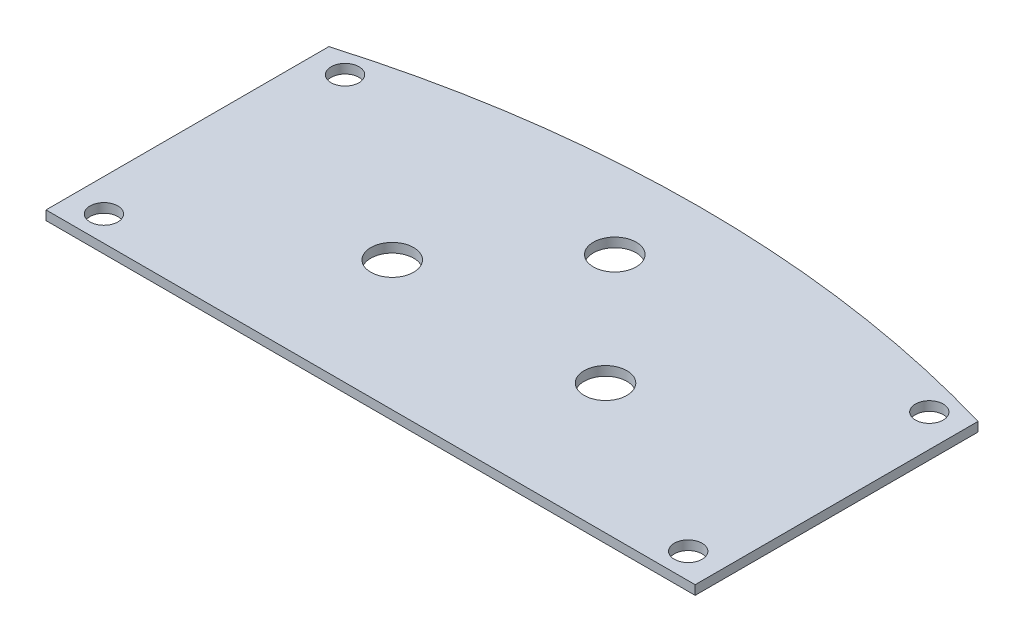
ISO-10303-21;
HEADER;
FILE_DESCRIPTION(('STEP AP214'),'2;1');
FILE_NAME('part.step','',(''),(''),'','','');
FILE_SCHEMA(('AUTOMOTIVE_DESIGN { 1 0 10303 214 1 1 1 1 }'));
ENDSEC;
DATA;
#1=APPLICATION_CONTEXT('core data for automotive mechanical design processes');
#2=APPLICATION_PROTOCOL_DEFINITION('international standard','automotive_design',2000,#1);
#3=PRODUCT_CONTEXT('',#1,'mechanical');
#4=PRODUCT('Part','Part','',(#3));
#5=PRODUCT_RELATED_PRODUCT_CATEGORY('part','',(#4));
#6=PRODUCT_DEFINITION_FORMATION('','',#4);
#7=PRODUCT_DEFINITION_CONTEXT('part definition',#1,'design');
#8=PRODUCT_DEFINITION('design','',#6,#7);
#9=PRODUCT_DEFINITION_SHAPE('','',#8);
#10=(LENGTH_UNIT() NAMED_UNIT(*) SI_UNIT(.MILLI.,.METRE.));
#11=(NAMED_UNIT(*) PLANE_ANGLE_UNIT() SI_UNIT($,.RADIAN.));
#12=(NAMED_UNIT(*) SI_UNIT($,.STERADIAN.) SOLID_ANGLE_UNIT());
#13=UNCERTAINTY_MEASURE_WITH_UNIT(LENGTH_MEASURE(1.E-05),#10,'distance_accuracy_value','');
#14=(GEOMETRIC_REPRESENTATION_CONTEXT(3) GLOBAL_UNCERTAINTY_ASSIGNED_CONTEXT((#13)) GLOBAL_UNIT_ASSIGNED_CONTEXT((#10,
#11,#12)) REPRESENTATION_CONTEXT('',''));
#15=CARTESIAN_POINT('',(0.,0.,0.));
#16=DIRECTION('',(0.,0.,1.));
#17=DIRECTION('',(1.,0.,0.));
#18=AXIS2_PLACEMENT_3D('',#15,#16,#17);
#19=CARTESIAN_POINT('',(0.,3.,210.156596281632));
#20=DIRECTION('',(0.,-1.,0.));
#21=DIRECTION('',(0.,0.,-1.));
#22=AXIS2_PLACEMENT_3D('',#19,#20,#21);
#23=CYLINDRICAL_SURFACE('',#22,248.710616879806);
#24=DIRECTION('',(0.,-1.,0.));
#25=VECTOR('',#24,1.);
#26=CARTESIAN_POINT('',(70.,3.,-28.5));
#27=LINE('',#26,#25);
#28=CARTESIAN_POINT('',(70.,3.,-28.5));
#29=VERTEX_POINT('',#28);
#30=CARTESIAN_POINT('',(70.,1.,-28.5));
#31=VERTEX_POINT('',#30);
#32=EDGE_CURVE('E98',#29,#31,#27,.T.);
#33=ORIENTED_EDGE('',*,*,#32,.T.);
#34=CARTESIAN_POINT('',(0.,1.,210.156596281632));
#35=DIRECTION('',(0.,1.,0.));
#36=DIRECTION('',(0.,0.,1.));
#37=AXIS2_PLACEMENT_3D('',#34,#35,#36);
#38=CIRCLE('',#37,248.710616879806);
#39=CARTESIAN_POINT('',(-70.,1.,-28.5));
#40=VERTEX_POINT('',#39);
#41=EDGE_CURVE('E55',#31,#40,#38,.T.);
#42=ORIENTED_EDGE('',*,*,#41,.T.);
#43=DIRECTION('',(0.,-1.,0.));
#44=VECTOR('',#43,1.);
#45=CARTESIAN_POINT('',(-70.,3.,-28.5));
#46=LINE('',#45,#44);
#47=CARTESIAN_POINT('',(-70.,3.,-28.5));
#48=VERTEX_POINT('',#47);
#49=EDGE_CURVE('E11',#48,#40,#46,.T.);
#50=ORIENTED_EDGE('',*,*,#49,.F.);
#51=CARTESIAN_POINT('',(0.,3.,210.156596281632));
#52=DIRECTION('',(0.,1.,0.));
#53=DIRECTION('',(0.,0.,-1.));
#54=AXIS2_PLACEMENT_3D('',#51,#52,#53);
#55=CIRCLE('',#54,248.710616879806);
#56=EDGE_CURVE('E108',#29,#48,#55,.T.);
#57=ORIENTED_EDGE('',*,*,#56,.F.);
#58=EDGE_LOOP('',(#33,#42,#50,#57));
#59=FACE_BOUND('',#58,.T.);
#60=ADVANCED_FACE('F40',(#59),#23,.T.);
#61=CARTESIAN_POINT('',(-70.,3.,32.5));
#62=DIRECTION('',(1.,0.,0.));
#63=DIRECTION('',(0.,0.,-1.));
#64=AXIS2_PLACEMENT_3D('',#61,#62,#63);
#65=PLANE('',#64);
#66=ORIENTED_EDGE('',*,*,#49,.T.);
#67=DIRECTION('',(0.,0.,1.));
#68=VECTOR('',#67,1.);
#69=CARTESIAN_POINT('',(-70.,1.,-47.5));
#70=LINE('',#69,#68);
#71=CARTESIAN_POINT('',(-70.,1.,32.5));
#72=VERTEX_POINT('',#71);
#73=EDGE_CURVE('E87',#40,#72,#70,.T.);
#74=ORIENTED_EDGE('',*,*,#73,.T.);
#75=DIRECTION('',(0.,-1.,0.));
#76=VECTOR('',#75,1.);
#77=CARTESIAN_POINT('',(-70.,3.,32.5));
#78=LINE('',#77,#76);
#79=CARTESIAN_POINT('',(-70.,3.,32.5));
#80=VERTEX_POINT('',#79);
#81=EDGE_CURVE('E48',#80,#72,#78,.T.);
#82=ORIENTED_EDGE('',*,*,#81,.F.);
#83=DIRECTION('',(0.,0.,1.));
#84=VECTOR('',#83,1.);
#85=CARTESIAN_POINT('',(-70.,3.,32.5));
#86=LINE('',#85,#84);
#87=EDGE_CURVE('E106',#48,#80,#86,.T.);
#88=ORIENTED_EDGE('',*,*,#87,.F.);
#89=EDGE_LOOP('',(#66,#74,#82,#88));
#90=FACE_BOUND('',#89,.T.);
#91=ADVANCED_FACE('F181',(#90),#65,.F.);
#92=CARTESIAN_POINT('',(-70.,3.,32.5));
#93=DIRECTION('',(0.,0.,-1.));
#94=DIRECTION('',(-1.,0.,0.));
#95=AXIS2_PLACEMENT_3D('',#92,#93,#94);
#96=PLANE('',#95);
#97=ORIENTED_EDGE('',*,*,#81,.T.);
#98=DIRECTION('',(-1.,0.,0.));
#99=VECTOR('',#98,1.);
#100=CARTESIAN_POINT('',(-70.,1.,32.5));
#101=LINE('',#100,#99);
#102=CARTESIAN_POINT('',(70.,1.,32.5));
#103=VERTEX_POINT('',#102);
#104=EDGE_CURVE('E82',#103,#72,#101,.T.);
#105=ORIENTED_EDGE('',*,*,#104,.F.);
#106=DIRECTION('',(0.,-1.,0.));
#107=VECTOR('',#106,1.);
#108=CARTESIAN_POINT('',(70.,3.,32.5));
#109=LINE('',#108,#107);
#110=CARTESIAN_POINT('',(70.,3.,32.5));
#111=VERTEX_POINT('',#110);
#112=EDGE_CURVE('E94',#111,#103,#109,.T.);
#113=ORIENTED_EDGE('',*,*,#112,.F.);
#114=DIRECTION('',(1.,0.,0.));
#115=VECTOR('',#114,1.);
#116=CARTESIAN_POINT('',(-70.,3.,32.5));
#117=LINE('',#116,#115);
#118=EDGE_CURVE('E104',#80,#111,#117,.T.);
#119=ORIENTED_EDGE('',*,*,#118,.F.);
#120=EDGE_LOOP('',(#97,#105,#113,#119));
#121=FACE_BOUND('',#120,.T.);
#122=ADVANCED_FACE('F92',(#121),#96,.F.);
#123=CARTESIAN_POINT('',(70.,3.,-28.5));
#124=DIRECTION('',(-1.,0.,0.));
#125=DIRECTION('',(0.,0.,1.));
#126=AXIS2_PLACEMENT_3D('',#123,#124,#125);
#127=PLANE('',#126);
#128=ORIENTED_EDGE('',*,*,#112,.T.);
#129=DIRECTION('',(0.,0.,1.));
#130=VECTOR('',#129,1.);
#131=CARTESIAN_POINT('',(70.,1.,-47.5));
#132=LINE('',#131,#130);
#133=EDGE_CURVE('E79',#31,#103,#132,.T.);
#134=ORIENTED_EDGE('',*,*,#133,.F.);
#135=ORIENTED_EDGE('',*,*,#32,.F.);
#136=DIRECTION('',(0.,0.,-1.));
#137=VECTOR('',#136,1.);
#138=CARTESIAN_POINT('',(70.,3.,-28.5));
#139=LINE('',#138,#137);
#140=EDGE_CURVE('E63',#111,#29,#139,.T.);
#141=ORIENTED_EDGE('',*,*,#140,.F.);
#142=EDGE_LOOP('',(#128,#134,#135,#141));
#143=FACE_BOUND('',#142,.T.);
#144=ADVANCED_FACE('F97',(#143),#127,.F.);
#145=CARTESIAN_POINT('',(0.,3.,210.156596281632));
#146=DIRECTION('',(0.,-1.,0.));
#147=DIRECTION('',(0.,0.,-1.));
#148=AXIS2_PLACEMENT_3D('',#145,#146,#147);
#149=PLANE('',#148);
#150=CARTESIAN_POINT('',(-23.33,3.,4.50000000000001));
#151=DIRECTION('',(0.,1.,0.));
#152=DIRECTION('',(0.,0.,1.));
#153=AXIS2_PLACEMENT_3D('',#150,#151,#152);
#154=CIRCLE('',#153,4.62);
#155=CARTESIAN_POINT('',(-23.33,3.,9.12000000000001));
#156=VERTEX_POINT('',#155);
#157=EDGE_CURVE('E122',#156,#156,#154,.T.);
#158=ORIENTED_EDGE('',*,*,#157,.F.);
#159=EDGE_LOOP('',(#158));
#160=FACE_BOUND('',#159,.T.);
#161=CARTESIAN_POINT('',(22.67,3.,4.50000000000001));
#162=DIRECTION('',(0.,1.,0.));
#163=DIRECTION('',(0.,0.,1.));
#164=AXIS2_PLACEMENT_3D('',#161,#162,#163);
#165=CIRCLE('',#164,4.62);
#166=CARTESIAN_POINT('',(22.67,3.,9.12000000000001));
#167=VERTEX_POINT('',#166);
#168=EDGE_CURVE('E126',#167,#167,#165,.T.);
#169=ORIENTED_EDGE('',*,*,#168,.F.);
#170=EDGE_LOOP('',(#169));
#171=FACE_BOUND('',#170,.T.);
#172=CARTESIAN_POINT('',(-0.330000000000004,3.,-20.4992179877691));
#173=DIRECTION('',(0.,1.,0.));
#174=DIRECTION('',(0.,0.,1.));
#175=AXIS2_PLACEMENT_3D('',#172,#173,#174);
#176=CIRCLE('',#175,4.62);
#177=CARTESIAN_POINT('',(-0.330000000000004,3.,-15.8792179877691));
#178=VERTEX_POINT('',#177);
#179=EDGE_CURVE('E123',#178,#178,#176,.T.);
#180=ORIENTED_EDGE('',*,*,#179,.F.);
#181=EDGE_LOOP('',(#180));
#182=FACE_BOUND('',#181,.T.);
#183=CARTESIAN_POINT('',(-63.,3.,27.));
#184=DIRECTION('',(0.,1.,0.));
#185=DIRECTION('',(0.,0.,1.));
#186=AXIS2_PLACEMENT_3D('',#183,#184,#185);
#187=CIRCLE('',#186,3.);
#188=CARTESIAN_POINT('',(-63.,3.,30.));
#189=VERTEX_POINT('',#188);
#190=EDGE_CURVE('E113',#189,#189,#187,.T.);
#191=ORIENTED_EDGE('',*,*,#190,.F.);
#192=EDGE_LOOP('',(#191));
#193=FACE_BOUND('',#192,.T.);
#194=CARTESIAN_POINT('',(63.,3.,-25.));
#195=DIRECTION('',(0.,1.,0.));
#196=DIRECTION('',(0.,0.,1.));
#197=AXIS2_PLACEMENT_3D('',#194,#195,#196);
#198=CIRCLE('',#197,3.00000000000001);
#199=CARTESIAN_POINT('',(63.,3.,-22.));
#200=VERTEX_POINT('',#199);
#201=EDGE_CURVE('E114',#200,#200,#198,.T.);
#202=ORIENTED_EDGE('',*,*,#201,.F.);
#203=EDGE_LOOP('',(#202));
#204=FACE_BOUND('',#203,.T.);
#205=CARTESIAN_POINT('',(63.,3.,27.));
#206=DIRECTION('',(0.,1.,0.));
#207=DIRECTION('',(0.,0.,1.));
#208=AXIS2_PLACEMENT_3D('',#205,#206,#207);
#209=CIRCLE('',#208,3.00000000000001);
#210=CARTESIAN_POINT('',(63.,3.,30.));
#211=VERTEX_POINT('',#210);
#212=EDGE_CURVE('E117',#211,#211,#209,.T.);
#213=ORIENTED_EDGE('',*,*,#212,.F.);
#214=EDGE_LOOP('',(#213));
#215=FACE_BOUND('',#214,.T.);
#216=CARTESIAN_POINT('',(-63.,3.,-25.));
#217=DIRECTION('',(0.,1.,0.));
#218=DIRECTION('',(0.,0.,1.));
#219=AXIS2_PLACEMENT_3D('',#216,#217,#218);
#220=CIRCLE('',#219,3.);
#221=CARTESIAN_POINT('',(-63.,3.,-22.));
#222=VERTEX_POINT('',#221);
#223=EDGE_CURVE('E110',#222,#222,#220,.T.);
#224=ORIENTED_EDGE('',*,*,#223,.F.);
#225=EDGE_LOOP('',(#224));
#226=FACE_BOUND('',#225,.T.);
#227=ORIENTED_EDGE('',*,*,#56,.T.);
#228=ORIENTED_EDGE('',*,*,#87,.T.);
#229=ORIENTED_EDGE('',*,*,#118,.T.);
#230=ORIENTED_EDGE('',*,*,#140,.T.);
#231=EDGE_LOOP('',(#227,#228,#229,#230));
#232=FACE_BOUND('',#231,.T.);
#233=ADVANCED_FACE('F171',(#160,#171,#182,#193,#204,#215,#226,#232),#149,.F.);
#234=CARTESIAN_POINT('',(-63.,-7.,-25.));
#235=DIRECTION('',(0.,1.,0.));
#236=DIRECTION('',(0.,0.,1.));
#237=AXIS2_PLACEMENT_3D('',#234,#235,#236);
#238=CYLINDRICAL_SURFACE('',#237,3.);
#239=CARTESIAN_POINT('',(-63.,1.,-25.));
#240=DIRECTION('',(0.,1.,0.));
#241=DIRECTION('',(0.,0.,1.));
#242=AXIS2_PLACEMENT_3D('',#239,#240,#241);
#243=CIRCLE('',#242,3.);
#244=CARTESIAN_POINT('',(-63.,1.,-22.));
#245=VERTEX_POINT('',#244);
#246=EDGE_CURVE('E132',#245,#245,#243,.F.);
#247=ORIENTED_EDGE('',*,*,#246,.T.);
#248=EDGE_LOOP('',(#247));
#249=FACE_BOUND('',#248,.T.);
#250=ORIENTED_EDGE('',*,*,#223,.T.);
#251=EDGE_LOOP('',(#250));
#252=FACE_BOUND('',#251,.T.);
#253=ADVANCED_FACE('F167',(#249,#252),#238,.F.);
#254=CARTESIAN_POINT('',(63.,-7.,27.));
#255=DIRECTION('',(0.,1.,0.));
#256=DIRECTION('',(0.,0.,1.));
#257=AXIS2_PLACEMENT_3D('',#254,#255,#256);
#258=CYLINDRICAL_SURFACE('',#257,3.00000000000001);
#259=CARTESIAN_POINT('',(63.,1.,27.));
#260=DIRECTION('',(0.,1.,0.));
#261=DIRECTION('',(0.,0.,1.));
#262=AXIS2_PLACEMENT_3D('',#259,#260,#261);
#263=CIRCLE('',#262,3.00000000000001);
#264=CARTESIAN_POINT('',(63.,1.,30.));
#265=VERTEX_POINT('',#264);
#266=EDGE_CURVE('E135',#265,#265,#263,.F.);
#267=ORIENTED_EDGE('',*,*,#266,.T.);
#268=EDGE_LOOP('',(#267));
#269=FACE_BOUND('',#268,.T.);
#270=ORIENTED_EDGE('',*,*,#212,.T.);
#271=EDGE_LOOP('',(#270));
#272=FACE_BOUND('',#271,.T.);
#273=ADVANCED_FACE('F170',(#269,#272),#258,.F.);
#274=CARTESIAN_POINT('',(63.,-7.,-25.));
#275=DIRECTION('',(0.,1.,0.));
#276=DIRECTION('',(0.,0.,1.));
#277=AXIS2_PLACEMENT_3D('',#274,#275,#276);
#278=CYLINDRICAL_SURFACE('',#277,3.00000000000001);
#279=CARTESIAN_POINT('',(63.,1.,-25.));
#280=DIRECTION('',(0.,1.,0.));
#281=DIRECTION('',(0.,0.,1.));
#282=AXIS2_PLACEMENT_3D('',#279,#280,#281);
#283=CIRCLE('',#282,3.00000000000001);
#284=CARTESIAN_POINT('',(63.,1.,-22.));
#285=VERTEX_POINT('',#284);
#286=EDGE_CURVE('E138',#285,#285,#283,.F.);
#287=ORIENTED_EDGE('',*,*,#286,.T.);
#288=EDGE_LOOP('',(#287));
#289=FACE_BOUND('',#288,.T.);
#290=ORIENTED_EDGE('',*,*,#201,.T.);
#291=EDGE_LOOP('',(#290));
#292=FACE_BOUND('',#291,.T.);
#293=ADVANCED_FACE('F191',(#289,#292),#278,.F.);
#294=CARTESIAN_POINT('',(-63.,-7.,27.));
#295=DIRECTION('',(0.,1.,0.));
#296=DIRECTION('',(0.,0.,1.));
#297=AXIS2_PLACEMENT_3D('',#294,#295,#296);
#298=CYLINDRICAL_SURFACE('',#297,3.);
#299=CARTESIAN_POINT('',(-63.,1.,27.));
#300=DIRECTION('',(0.,1.,0.));
#301=DIRECTION('',(0.,0.,1.));
#302=AXIS2_PLACEMENT_3D('',#299,#300,#301);
#303=CIRCLE('',#302,3.);
#304=CARTESIAN_POINT('',(-63.,1.,30.));
#305=VERTEX_POINT('',#304);
#306=EDGE_CURVE('E141',#305,#305,#303,.F.);
#307=ORIENTED_EDGE('',*,*,#306,.T.);
#308=EDGE_LOOP('',(#307));
#309=FACE_BOUND('',#308,.T.);
#310=ORIENTED_EDGE('',*,*,#190,.T.);
#311=EDGE_LOOP('',(#310));
#312=FACE_BOUND('',#311,.T.);
#313=ADVANCED_FACE('F194',(#309,#312),#298,.F.);
#314=CARTESIAN_POINT('',(-0.330000000000004,-7.,-20.4992179877691));
#315=DIRECTION('',(0.,1.,0.));
#316=DIRECTION('',(0.,0.,1.));
#317=AXIS2_PLACEMENT_3D('',#314,#315,#316);
#318=CYLINDRICAL_SURFACE('',#317,4.62);
#319=CARTESIAN_POINT('',(-0.330000000000004,1.,-20.4992179877691));
#320=DIRECTION('',(0.,1.,0.));
#321=DIRECTION('',(0.,0.,1.));
#322=AXIS2_PLACEMENT_3D('',#319,#320,#321);
#323=CIRCLE('',#322,4.62);
#324=CARTESIAN_POINT('',(-0.330000000000004,1.,-15.8792179877691));
#325=VERTEX_POINT('',#324);
#326=EDGE_CURVE('E144',#325,#325,#323,.F.);
#327=ORIENTED_EDGE('',*,*,#326,.T.);
#328=EDGE_LOOP('',(#327));
#329=FACE_BOUND('',#328,.T.);
#330=ORIENTED_EDGE('',*,*,#179,.T.);
#331=EDGE_LOOP('',(#330));
#332=FACE_BOUND('',#331,.T.);
#333=ADVANCED_FACE('F198',(#329,#332),#318,.F.);
#334=CARTESIAN_POINT('',(22.67,-7.,4.50000000000001));
#335=DIRECTION('',(0.,1.,0.));
#336=DIRECTION('',(0.,0.,1.));
#337=AXIS2_PLACEMENT_3D('',#334,#335,#336);
#338=CYLINDRICAL_SURFACE('',#337,4.62);
#339=CARTESIAN_POINT('',(22.67,1.,4.50000000000001));
#340=DIRECTION('',(0.,1.,0.));
#341=DIRECTION('',(0.,0.,1.));
#342=AXIS2_PLACEMENT_3D('',#339,#340,#341);
#343=CIRCLE('',#342,4.62);
#344=CARTESIAN_POINT('',(22.67,1.,9.12000000000001));
#345=VERTEX_POINT('',#344);
#346=EDGE_CURVE('E147',#345,#345,#343,.F.);
#347=ORIENTED_EDGE('',*,*,#346,.T.);
#348=EDGE_LOOP('',(#347));
#349=FACE_BOUND('',#348,.T.);
#350=ORIENTED_EDGE('',*,*,#168,.T.);
#351=EDGE_LOOP('',(#350));
#352=FACE_BOUND('',#351,.T.);
#353=ADVANCED_FACE('F205',(#349,#352),#338,.F.);
#354=CARTESIAN_POINT('',(-23.33,-7.,4.50000000000001));
#355=DIRECTION('',(0.,1.,0.));
#356=DIRECTION('',(0.,0.,1.));
#357=AXIS2_PLACEMENT_3D('',#354,#355,#356);
#358=CYLINDRICAL_SURFACE('',#357,4.62);
#359=CARTESIAN_POINT('',(-23.33,1.,4.50000000000001));
#360=DIRECTION('',(0.,1.,0.));
#361=DIRECTION('',(0.,0.,1.));
#362=AXIS2_PLACEMENT_3D('',#359,#360,#361);
#363=CIRCLE('',#362,4.62);
#364=CARTESIAN_POINT('',(-23.33,1.,9.12000000000001));
#365=VERTEX_POINT('',#364);
#366=EDGE_CURVE('E43',#365,#365,#363,.F.);
#367=ORIENTED_EDGE('',*,*,#366,.T.);
#368=EDGE_LOOP('',(#367));
#369=FACE_BOUND('',#368,.T.);
#370=ORIENTED_EDGE('',*,*,#157,.T.);
#371=EDGE_LOOP('',(#370));
#372=FACE_BOUND('',#371,.T.);
#373=ADVANCED_FACE('F154',(#369,#372),#358,.F.);
#374=CARTESIAN_POINT('',(-70.,1.,-47.5));
#375=DIRECTION('',(0.,1.,0.));
#376=DIRECTION('',(0.,0.,1.));
#377=AXIS2_PLACEMENT_3D('',#374,#375,#376);
#378=PLANE('',#377);
#379=ORIENTED_EDGE('',*,*,#266,.F.);
#380=EDGE_LOOP('',(#379));
#381=FACE_BOUND('',#380,.T.);
#382=ORIENTED_EDGE('',*,*,#306,.F.);
#383=EDGE_LOOP('',(#382));
#384=FACE_BOUND('',#383,.T.);
#385=ORIENTED_EDGE('',*,*,#346,.F.);
#386=EDGE_LOOP('',(#385));
#387=FACE_BOUND('',#386,.T.);
#388=ORIENTED_EDGE('',*,*,#366,.F.);
#389=EDGE_LOOP('',(#388));
#390=FACE_BOUND('',#389,.T.);
#391=ORIENTED_EDGE('',*,*,#326,.F.);
#392=EDGE_LOOP('',(#391));
#393=FACE_BOUND('',#392,.T.);
#394=ORIENTED_EDGE('',*,*,#286,.F.);
#395=EDGE_LOOP('',(#394));
#396=FACE_BOUND('',#395,.T.);
#397=ORIENTED_EDGE('',*,*,#246,.F.);
#398=EDGE_LOOP('',(#397));
#399=FACE_BOUND('',#398,.T.);
#400=ORIENTED_EDGE('',*,*,#133,.T.);
#401=ORIENTED_EDGE('',*,*,#104,.T.);
#402=ORIENTED_EDGE('',*,*,#73,.F.);
#403=ORIENTED_EDGE('',*,*,#41,.F.);
#404=EDGE_LOOP('',(#400,#401,#402,#403));
#405=FACE_BOUND('',#404,.T.);
#406=ADVANCED_FACE('F81',(#381,#384,#387,#390,#393,#396,#399,#405),#378,.F.);
#407=CLOSED_SHELL('',(#60,#91,#122,#144,#233,#253,#273,#293,#313,#333,#353,#373,#406));
#408=MANIFOLD_SOLID_BREP('B2',#407);
#409=ADVANCED_BREP_SHAPE_REPRESENTATION('',(#18,#408),#14);
#410=SHAPE_DEFINITION_REPRESENTATION(#9,#409);
ENDSEC;
END-ISO-10303-21;
